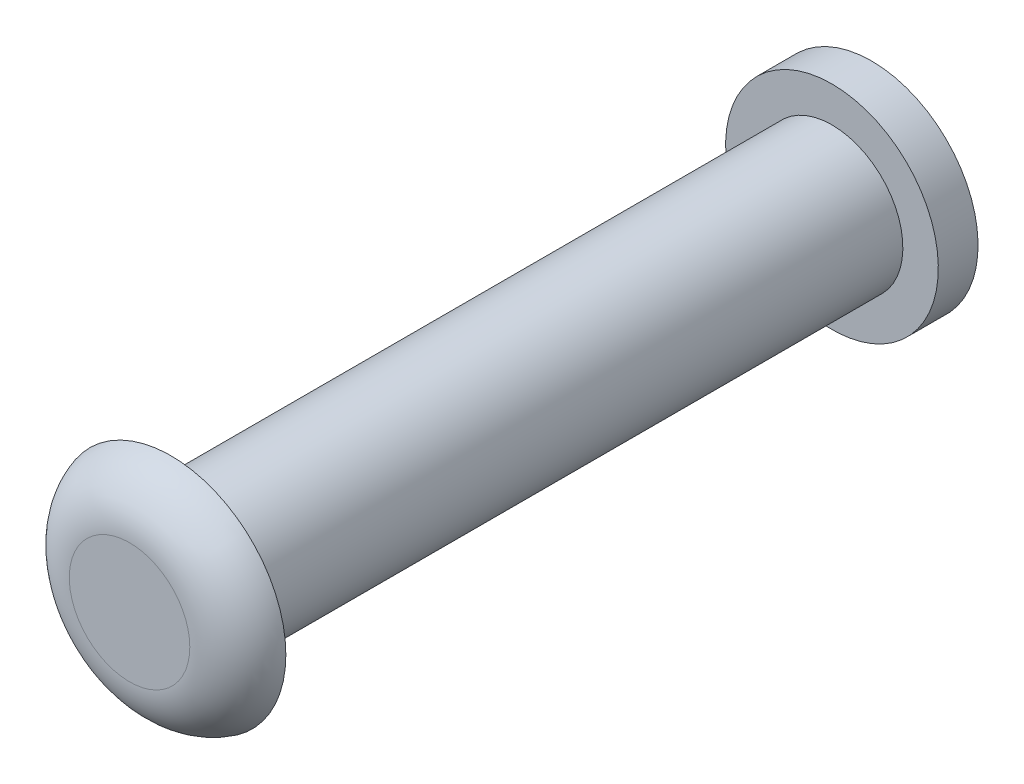
ISO-10303-21;
HEADER;
FILE_DESCRIPTION(('STEP AP214'),'2;1');
FILE_NAME('part.step','',(''),(''),'','','');
FILE_SCHEMA(('AUTOMOTIVE_DESIGN { 1 0 10303 214 1 1 1 1 }'));
ENDSEC;
DATA;
#1=APPLICATION_CONTEXT('core data for automotive mechanical design processes');
#2=APPLICATION_PROTOCOL_DEFINITION('international standard','automotive_design',2000,#1);
#3=PRODUCT_CONTEXT('',#1,'mechanical');
#4=PRODUCT('Part','Part','',(#3));
#5=PRODUCT_RELATED_PRODUCT_CATEGORY('part','',(#4));
#6=PRODUCT_DEFINITION_FORMATION('','',#4);
#7=PRODUCT_DEFINITION_CONTEXT('part definition',#1,'design');
#8=PRODUCT_DEFINITION('design','',#6,#7);
#9=PRODUCT_DEFINITION_SHAPE('','',#8);
#10=(LENGTH_UNIT() NAMED_UNIT(*) SI_UNIT(.MILLI.,.METRE.));
#11=(NAMED_UNIT(*) PLANE_ANGLE_UNIT() SI_UNIT($,.RADIAN.));
#12=(NAMED_UNIT(*) SI_UNIT($,.STERADIAN.) SOLID_ANGLE_UNIT());
#13=UNCERTAINTY_MEASURE_WITH_UNIT(LENGTH_MEASURE(1.E-05),#10,'distance_accuracy_value','');
#14=(GEOMETRIC_REPRESENTATION_CONTEXT(3) GLOBAL_UNCERTAINTY_ASSIGNED_CONTEXT((#13)) GLOBAL_UNIT_ASSIGNED_CONTEXT((#10,
#11,#12)) REPRESENTATION_CONTEXT('',''));
#15=CARTESIAN_POINT('',(0.,0.,0.));
#16=DIRECTION('',(0.,0.,1.));
#17=DIRECTION('',(1.,0.,0.));
#18=AXIS2_PLACEMENT_3D('',#15,#16,#17);
#19=CARTESIAN_POINT('',(0.,0.,17.4625));
#20=DIRECTION('',(0.,0.,-1.));
#21=DIRECTION('',(-1.,0.,0.));
#22=AXIS2_PLACEMENT_3D('',#19,#20,#21);
#23=CYLINDRICAL_SURFACE('',#22,3.175);
#24=CARTESIAN_POINT('',(0.,0.,17.4625));
#25=DIRECTION('',(0.,0.,1.));
#26=DIRECTION('',(1.,0.,0.));
#27=AXIS2_PLACEMENT_3D('',#24,#25,#26);
#28=CIRCLE('',#27,3.175);
#29=CARTESIAN_POINT('',(3.175,0.,17.4625));
#30=VERTEX_POINT('',#29);
#31=EDGE_CURVE('E25',#30,#30,#28,.T.);
#32=ORIENTED_EDGE('',*,*,#31,.F.);
#33=EDGE_LOOP('',(#32));
#34=FACE_BOUND('',#33,.T.);
#35=CARTESIAN_POINT('',(0.,0.,-12.1285));
#36=DIRECTION('',(0.,0.,-1.));
#37=DIRECTION('',(0.,1.,0.));
#38=AXIS2_PLACEMENT_3D('',#35,#36,#37);
#39=CIRCLE('',#38,3.175);
#40=CARTESIAN_POINT('',(0.,3.175,-12.1285));
#41=VERTEX_POINT('',#40);
#42=EDGE_CURVE('E10',#41,#41,#39,.T.);
#43=ORIENTED_EDGE('',*,*,#42,.F.);
#44=EDGE_LOOP('',(#43));
#45=FACE_BOUND('',#44,.T.);
#46=ADVANCED_FACE('F14',(#34,#45),#23,.T.);
#47=CARTESIAN_POINT('',(0.,0.,17.4625));
#48=DIRECTION('',(0.,0.,1.));
#49=DIRECTION('',(1.,0.,0.));
#50=AXIS2_PLACEMENT_3D('',#47,#48,#49);
#51=PLANE('',#50);
#52=CARTESIAN_POINT('',(0.,0.,17.4625));
#53=DIRECTION('',(0.,0.,1.));
#54=DIRECTION('',(1.,0.,0.));
#55=AXIS2_PLACEMENT_3D('',#52,#53,#54);
#56=CIRCLE('',#55,5.1435);
#57=CARTESIAN_POINT('',(5.1435,0.,17.4625));
#58=VERTEX_POINT('',#57);
#59=EDGE_CURVE('E29',#58,#58,#56,.T.);
#60=ORIENTED_EDGE('',*,*,#59,.F.);
#61=EDGE_LOOP('',(#60));
#62=FACE_BOUND('',#61,.T.);
#63=ORIENTED_EDGE('',*,*,#31,.T.);
#64=EDGE_LOOP('',(#63));
#65=FACE_BOUND('',#64,.T.);
#66=ADVANCED_FACE('F59',(#62,#65),#51,.F.);
#67=CARTESIAN_POINT('',(0.,0.,19.3167));
#68=DIRECTION('',(0.,0.,1.));
#69=DIRECTION('',(1.,0.,0.));
#70=AXIS2_PLACEMENT_3D('',#67,#68,#69);
#71=PLANE('',#70);
#72=CARTESIAN_POINT('',(0.,0.,19.3167));
#73=DIRECTION('',(0.,0.,1.));
#74=DIRECTION('',(1.,0.,0.));
#75=AXIS2_PLACEMENT_3D('',#72,#73,#74);
#76=CIRCLE('',#75,2.69783478170049);
#77=CARTESIAN_POINT('',(2.69783478170049,0.,19.3167));
#78=VERTEX_POINT('',#77);
#79=EDGE_CURVE('E21',#78,#78,#76,.T.);
#80=ORIENTED_EDGE('',*,*,#79,.T.);
#81=EDGE_LOOP('',(#80));
#82=FACE_BOUND('',#81,.T.);
#83=ADVANCED_FACE('F65',(#82),#71,.T.);
#84=CARTESIAN_POINT('',(0.,0.,16.7767));
#85=DIRECTION('',(0.,0.,-1.));
#86=DIRECTION('',(-1.,0.,0.));
#87=AXIS2_PLACEMENT_3D('',#84,#85,#86);
#88=TOROIDAL_SURFACE('',#87,2.69783478170049,2.54);
#89=ORIENTED_EDGE('',*,*,#59,.T.);
#90=EDGE_LOOP('',(#89));
#91=FACE_BOUND('',#90,.T.);
#92=ORIENTED_EDGE('',*,*,#79,.F.);
#93=EDGE_LOOP('',(#92));
#94=FACE_BOUND('',#93,.T.);
#95=ADVANCED_FACE('F16',(#91,#94),#88,.T.);
#96=CARTESIAN_POINT('',(0.,0.,-13.9065));
#97=DIRECTION('',(0.,0.,-1.));
#98=DIRECTION('',(0.,1.,0.));
#99=AXIS2_PLACEMENT_3D('',#96,#97,#98);
#100=PLANE('',#99);
#101=CARTESIAN_POINT('',(0.,0.,-13.9065));
#102=DIRECTION('',(0.,0.,-1.));
#103=DIRECTION('',(0.,1.,0.));
#104=AXIS2_PLACEMENT_3D('',#101,#102,#103);
#105=CIRCLE('',#104,4.7625);
#106=CARTESIAN_POINT('',(0.,4.76250000000001,-13.9065));
#107=VERTEX_POINT('',#106);
#108=EDGE_CURVE('E34',#107,#107,#105,.T.);
#109=ORIENTED_EDGE('',*,*,#108,.T.);
#110=EDGE_LOOP('',(#109));
#111=FACE_BOUND('',#110,.T.);
#112=ADVANCED_FACE('F41',(#111),#100,.T.);
#113=CARTESIAN_POINT('',(0.,0.,-12.1285));
#114=DIRECTION('',(0.,0.,-1.));
#115=DIRECTION('',(0.,1.,0.));
#116=AXIS2_PLACEMENT_3D('',#113,#114,#115);
#117=PLANE('',#116);
#118=CARTESIAN_POINT('',(0.,0.,-12.1285));
#119=DIRECTION('',(0.,0.,-1.));
#120=DIRECTION('',(0.,1.,0.));
#121=AXIS2_PLACEMENT_3D('',#118,#119,#120);
#122=CIRCLE('',#121,4.7625);
#123=CARTESIAN_POINT('',(0.,4.76250000000001,-12.1285));
#124=VERTEX_POINT('',#123);
#125=EDGE_CURVE('E35',#124,#124,#122,.T.);
#126=ORIENTED_EDGE('',*,*,#125,.F.);
#127=EDGE_LOOP('',(#126));
#128=FACE_BOUND('',#127,.T.);
#129=ORIENTED_EDGE('',*,*,#42,.T.);
#130=EDGE_LOOP('',(#129));
#131=FACE_BOUND('',#130,.T.);
#132=ADVANCED_FACE('F46',(#128,#131),#117,.F.);
#133=CARTESIAN_POINT('',(0.,0.,-13.9065));
#134=DIRECTION('',(0.,0.,1.));
#135=DIRECTION('',(0.,-1.,0.));
#136=AXIS2_PLACEMENT_3D('',#133,#134,#135);
#137=CYLINDRICAL_SURFACE('',#136,4.7625);
#138=ORIENTED_EDGE('',*,*,#108,.F.);
#139=EDGE_LOOP('',(#138));
#140=FACE_BOUND('',#139,.T.);
#141=ORIENTED_EDGE('',*,*,#125,.T.);
#142=EDGE_LOOP('',(#141));
#143=FACE_BOUND('',#142,.T.);
#144=ADVANCED_FACE('F43',(#140,#143),#137,.T.);
#145=CLOSED_SHELL('',(#46,#66,#83,#95,#112,#132,#144));
#146=MANIFOLD_SOLID_BREP('B1',#145);
#147=ADVANCED_BREP_SHAPE_REPRESENTATION('',(#18,#146),#14);
#148=SHAPE_DEFINITION_REPRESENTATION(#9,#147);
ENDSEC;
END-ISO-10303-21;
